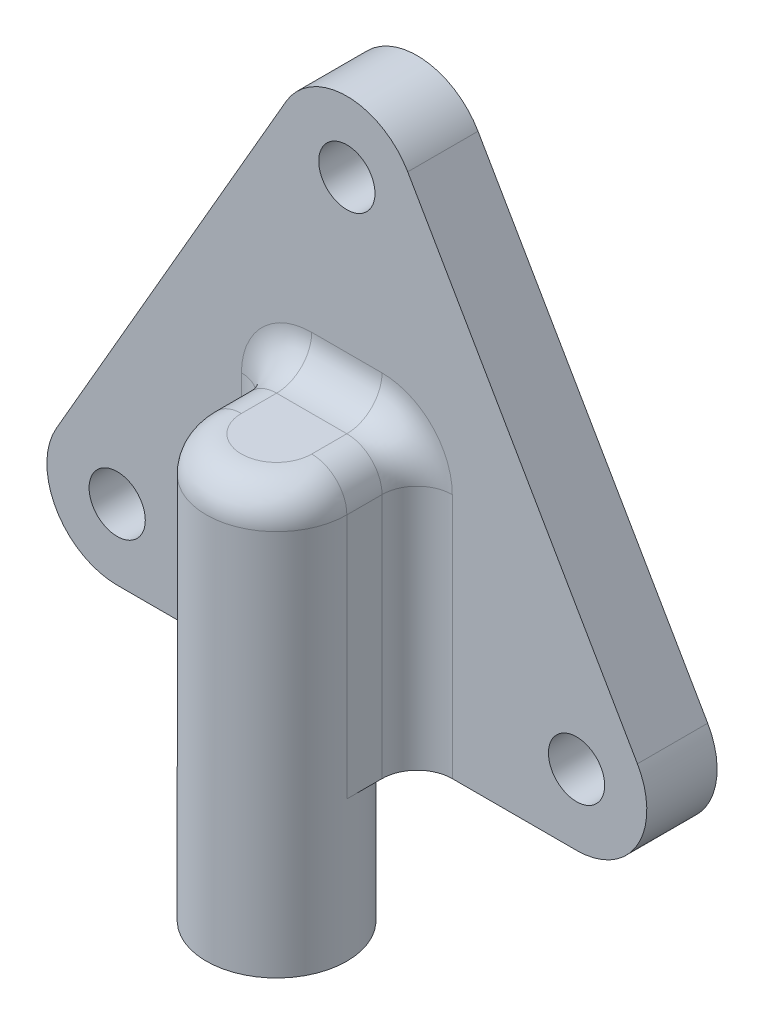
ISO-10303-21;
HEADER;
FILE_DESCRIPTION(('STEP AP214'),'2;1');
FILE_NAME('part.step','',(''),(''),'','','');
FILE_SCHEMA(('AUTOMOTIVE_DESIGN { 1 0 10303 214 1 1 1 1 }'));
ENDSEC;
DATA;
#1=APPLICATION_CONTEXT('core data for automotive mechanical design processes');
#2=APPLICATION_PROTOCOL_DEFINITION('international standard','automotive_design',2000,#1);
#3=PRODUCT_CONTEXT('',#1,'mechanical');
#4=PRODUCT('Part','Part','',(#3));
#5=PRODUCT_RELATED_PRODUCT_CATEGORY('part','',(#4));
#6=PRODUCT_DEFINITION_FORMATION('','',#4);
#7=PRODUCT_DEFINITION_CONTEXT('part definition',#1,'design');
#8=PRODUCT_DEFINITION('design','',#6,#7);
#9=PRODUCT_DEFINITION_SHAPE('','',#8);
#10=(LENGTH_UNIT() NAMED_UNIT(*) SI_UNIT(.MILLI.,.METRE.));
#11=(NAMED_UNIT(*) PLANE_ANGLE_UNIT() SI_UNIT($,.RADIAN.));
#12=(NAMED_UNIT(*) SI_UNIT($,.STERADIAN.) SOLID_ANGLE_UNIT());
#13=UNCERTAINTY_MEASURE_WITH_UNIT(LENGTH_MEASURE(1.E-05),#10,'distance_accuracy_value','');
#14=(GEOMETRIC_REPRESENTATION_CONTEXT(3) GLOBAL_UNCERTAINTY_ASSIGNED_CONTEXT((#13)) GLOBAL_UNIT_ASSIGNED_CONTEXT((#10,
#11,#12)) REPRESENTATION_CONTEXT('',''));
#15=CARTESIAN_POINT('',(0.,0.,0.));
#16=DIRECTION('',(0.,0.,1.));
#17=DIRECTION('',(1.,0.,0.));
#18=AXIS2_PLACEMENT_3D('',#15,#16,#17);
#19=CARTESIAN_POINT('',(-32.6794919243113,-28.8675134594813,10.));
#20=DIRECTION('',(0.,1.,0.));
#21=DIRECTION('',(-1.,0.,0.));
#22=AXIS2_PLACEMENT_3D('',#19,#20,#21);
#23=PLANE('',#22);
#24=CARTESIAN_POINT('',(0.,-28.8675134594813,20.));
#25=DIRECTION('',(0.,-1.,0.));
#26=DIRECTION('',(1.,0.,0.));
#27=AXIS2_PLACEMENT_3D('',#24,#25,#26);
#28=CIRCLE('',#27,10.);
#29=CARTESIAN_POINT('',(-10.,-28.8675134594813,20.));
#30=VERTEX_POINT('',#29);
#31=CARTESIAN_POINT('',(10.,-28.8675134594813,20.));
#32=VERTEX_POINT('',#31);
#33=EDGE_CURVE('E155',#30,#32,#28,.T.);
#34=ORIENTED_EDGE('',*,*,#33,.F.);
#35=DIRECTION('',(0.,0.,-1.));
#36=VECTOR('',#35,1.);
#37=CARTESIAN_POINT('',(-10.,-28.8675134594813,0.));
#38=LINE('',#37,#36);
#39=CARTESIAN_POINT('',(-10.,-28.8675134594813,15.));
#40=VERTEX_POINT('',#39);
#41=EDGE_CURVE('E161',#30,#40,#38,.T.);
#42=ORIENTED_EDGE('',*,*,#41,.T.);
#43=CARTESIAN_POINT('',(-15.,-28.8675134594813,15.));
#44=DIRECTION('',(0.,1.,0.));
#45=DIRECTION('',(-1.,0.,0.));
#46=AXIS2_PLACEMENT_3D('',#43,#44,#45);
#47=CIRCLE('',#46,5.);
#48=CARTESIAN_POINT('',(-15.,-28.8675134594813,10.));
#49=VERTEX_POINT('',#48);
#50=EDGE_CURVE('E11',#40,#49,#47,.T.);
#51=ORIENTED_EDGE('',*,*,#50,.T.);
#52=DIRECTION('',(1.,0.,0.));
#53=VECTOR('',#52,1.);
#54=CARTESIAN_POINT('',(-32.6794919243113,-28.8675134594813,10.));
#55=LINE('',#54,#53);
#56=CARTESIAN_POINT('',(-32.6794919243113,-28.8675134594813,10.));
#57=VERTEX_POINT('',#56);
#58=EDGE_CURVE('E185',#57,#49,#55,.T.);
#59=ORIENTED_EDGE('',*,*,#58,.F.);
#60=DIRECTION('',(0.,0.,-1.));
#61=VECTOR('',#60,1.);
#62=CARTESIAN_POINT('',(-32.6794919243113,-28.8675134594813,10.));
#63=LINE('',#62,#61);
#64=CARTESIAN_POINT('',(-32.6794919243113,-28.8675134594813,0.));
#65=VERTEX_POINT('',#64);
#66=EDGE_CURVE('E222',#57,#65,#63,.T.);
#67=ORIENTED_EDGE('',*,*,#66,.T.);
#68=DIRECTION('',(1.,0.,0.));
#69=VECTOR('',#68,1.);
#70=CARTESIAN_POINT('',(-32.6794919243113,-28.8675134594813,0.));
#71=LINE('',#70,#69);
#72=CARTESIAN_POINT('',(32.6794919243113,-28.8675134594813,0.));
#73=VERTEX_POINT('',#72);
#74=EDGE_CURVE('E199',#65,#73,#71,.T.);
#75=ORIENTED_EDGE('',*,*,#74,.T.);
#76=DIRECTION('',(0.,0.,-1.));
#77=VECTOR('',#76,1.);
#78=CARTESIAN_POINT('',(32.6794919243113,-28.8675134594813,10.));
#79=LINE('',#78,#77);
#80=CARTESIAN_POINT('',(32.6794919243113,-28.8675134594813,10.));
#81=VERTEX_POINT('',#80);
#82=EDGE_CURVE('E219',#81,#73,#79,.T.);
#83=ORIENTED_EDGE('',*,*,#82,.F.);
#84=CARTESIAN_POINT('',(15.,-28.8675134594813,10.));
#85=VERTEX_POINT('',#84);
#86=EDGE_CURVE('E183',#85,#81,#55,.T.);
#87=ORIENTED_EDGE('',*,*,#86,.F.);
#88=CARTESIAN_POINT('',(15.,-28.8675134594813,15.));
#89=DIRECTION('',(0.,1.,0.));
#90=DIRECTION('',(-1.,0.,0.));
#91=AXIS2_PLACEMENT_3D('',#88,#89,#90);
#92=CIRCLE('',#91,5.);
#93=CARTESIAN_POINT('',(10.,-28.8675134594813,15.));
#94=VERTEX_POINT('',#93);
#95=EDGE_CURVE('E48',#85,#94,#92,.T.);
#96=ORIENTED_EDGE('',*,*,#95,.T.);
#97=DIRECTION('',(0.,0.,1.));
#98=VECTOR('',#97,1.);
#99=CARTESIAN_POINT('',(9.99999999999999,-28.8675134594813,0.));
#100=LINE('',#99,#98);
#101=EDGE_CURVE('E159',#94,#32,#100,.T.);
#102=ORIENTED_EDGE('',*,*,#101,.T.);
#103=EDGE_LOOP('',(#34,#42,#51,#59,#67,#75,#83,#87,#96,#102));
#104=FACE_BOUND('',#103,.T.);
#105=ADVANCED_FACE('F39',(#104),#23,.F.);
#106=CARTESIAN_POINT('',(-32.6794919243113,-18.8675134594813,10.));
#107=DIRECTION('',(0.,0.,-1.));
#108=DIRECTION('',(-1.,0.,0.));
#109=AXIS2_PLACEMENT_3D('',#106,#107,#108);
#110=CYLINDRICAL_SURFACE('',#109,10.);
#111=CARTESIAN_POINT('',(-32.6794919243113,-18.8675134594813,0.));
#112=DIRECTION('',(0.,0.,1.));
#113=DIRECTION('',(1.,0.,0.));
#114=AXIS2_PLACEMENT_3D('',#111,#112,#113);
#115=CIRCLE('',#114,10.);
#116=CARTESIAN_POINT('',(-41.3397459621556,-13.8675134594813,0.));
#117=VERTEX_POINT('',#116);
#118=EDGE_CURVE('E178',#117,#65,#115,.T.);
#119=ORIENTED_EDGE('',*,*,#118,.T.);
#120=ORIENTED_EDGE('',*,*,#66,.F.);
#121=CARTESIAN_POINT('',(-32.6794919243113,-18.8675134594813,10.));
#122=DIRECTION('',(0.,0.,1.));
#123=DIRECTION('',(1.,0.,0.));
#124=AXIS2_PLACEMENT_3D('',#121,#122,#123);
#125=CIRCLE('',#124,10.);
#126=CARTESIAN_POINT('',(-41.3397459621556,-13.8675134594813,10.));
#127=VERTEX_POINT('',#126);
#128=EDGE_CURVE('E180',#127,#57,#125,.T.);
#129=ORIENTED_EDGE('',*,*,#128,.F.);
#130=DIRECTION('',(0.,0.,-1.));
#131=VECTOR('',#130,1.);
#132=CARTESIAN_POINT('',(-41.3397459621556,-13.8675134594813,10.));
#133=LINE('',#132,#131);
#134=EDGE_CURVE('E196',#127,#117,#133,.T.);
#135=ORIENTED_EDGE('',*,*,#134,.T.);
#136=EDGE_LOOP('',(#119,#120,#129,#135));
#137=FACE_BOUND('',#136,.T.);
#138=ADVANCED_FACE('F289',(#137),#110,.T.);
#139=CARTESIAN_POINT('',(32.6794919243113,-18.8675134594813,10.));
#140=DIRECTION('',(0.,0.,-1.));
#141=DIRECTION('',(-1.,0.,0.));
#142=AXIS2_PLACEMENT_3D('',#139,#140,#141);
#143=CYLINDRICAL_SURFACE('',#142,10.);
#144=CARTESIAN_POINT('',(32.6794919243113,-18.8675134594813,0.));
#145=DIRECTION('',(0.,0.,1.));
#146=DIRECTION('',(-1.,0.,0.));
#147=AXIS2_PLACEMENT_3D('',#144,#145,#146);
#148=CIRCLE('',#147,10.);
#149=CARTESIAN_POINT('',(41.3397459621556,-13.8675134594813,0.));
#150=VERTEX_POINT('',#149);
#151=EDGE_CURVE('E201',#73,#150,#148,.T.);
#152=ORIENTED_EDGE('',*,*,#151,.T.);
#153=DIRECTION('',(0.,0.,-1.));
#154=VECTOR('',#153,1.);
#155=CARTESIAN_POINT('',(41.3397459621556,-13.8675134594813,10.));
#156=LINE('',#155,#154);
#157=CARTESIAN_POINT('',(41.3397459621556,-13.8675134594813,10.));
#158=VERTEX_POINT('',#157);
#159=EDGE_CURVE('E216',#158,#150,#156,.T.);
#160=ORIENTED_EDGE('',*,*,#159,.F.);
#161=CARTESIAN_POINT('',(32.6794919243113,-18.8675134594813,10.));
#162=DIRECTION('',(0.,0.,1.));
#163=DIRECTION('',(-1.,0.,0.));
#164=AXIS2_PLACEMENT_3D('',#161,#162,#163);
#165=CIRCLE('',#164,10.);
#166=EDGE_CURVE('E188',#81,#158,#165,.T.);
#167=ORIENTED_EDGE('',*,*,#166,.F.);
#168=ORIENTED_EDGE('',*,*,#82,.T.);
#169=EDGE_LOOP('',(#152,#160,#167,#168));
#170=FACE_BOUND('',#169,.T.);
#171=ADVANCED_FACE('F297',(#170),#143,.T.);
#172=CARTESIAN_POINT('',(41.3397459621556,-13.8675134594813,10.));
#173=DIRECTION('',(-0.866025403784439,-0.5,0.));
#174=DIRECTION('',(0.5,-0.866025403784439,0.));
#175=AXIS2_PLACEMENT_3D('',#172,#173,#174);
#176=PLANE('',#175);
#177=DIRECTION('',(-0.5,0.866025403784439,0.));
#178=VECTOR('',#177,1.);
#179=CARTESIAN_POINT('',(41.3397459621556,-13.8675134594813,0.));
#180=LINE('',#179,#178);
#181=CARTESIAN_POINT('',(8.66025403784438,42.7350269189626,0.));
#182=VERTEX_POINT('',#181);
#183=EDGE_CURVE('E203',#150,#182,#180,.T.);
#184=ORIENTED_EDGE('',*,*,#183,.T.);
#185=DIRECTION('',(0.,0.,-1.));
#186=VECTOR('',#185,1.);
#187=CARTESIAN_POINT('',(8.66025403784438,42.7350269189626,10.));
#188=LINE('',#187,#186);
#189=CARTESIAN_POINT('',(8.66025403784438,42.7350269189626,10.));
#190=VERTEX_POINT('',#189);
#191=EDGE_CURVE('E213',#190,#182,#188,.T.);
#192=ORIENTED_EDGE('',*,*,#191,.F.);
#193=DIRECTION('',(-0.5,0.866025403784439,0.));
#194=VECTOR('',#193,1.);
#195=CARTESIAN_POINT('',(41.3397459621556,-13.8675134594813,10.));
#196=LINE('',#195,#194);
#197=EDGE_CURVE('E190',#158,#190,#196,.T.);
#198=ORIENTED_EDGE('',*,*,#197,.F.);
#199=ORIENTED_EDGE('',*,*,#159,.T.);
#200=EDGE_LOOP('',(#184,#192,#198,#199));
#201=FACE_BOUND('',#200,.T.);
#202=ADVANCED_FACE('F305',(#201),#176,.F.);
#203=CARTESIAN_POINT('',(0.,37.7350269189626,10.));
#204=DIRECTION('',(0.,0.,-1.));
#205=DIRECTION('',(-1.,0.,0.));
#206=AXIS2_PLACEMENT_3D('',#203,#204,#205);
#207=CYLINDRICAL_SURFACE('',#206,10.);
#208=CARTESIAN_POINT('',(0.,37.7350269189626,0.));
#209=DIRECTION('',(0.,0.,1.));
#210=DIRECTION('',(1.,0.,0.));
#211=AXIS2_PLACEMENT_3D('',#208,#209,#210);
#212=CIRCLE('',#211,10.);
#213=CARTESIAN_POINT('',(-8.66025403784439,42.7350269189626,0.));
#214=VERTEX_POINT('',#213);
#215=EDGE_CURVE('E205',#182,#214,#212,.T.);
#216=ORIENTED_EDGE('',*,*,#215,.T.);
#217=DIRECTION('',(0.,0.,-1.));
#218=VECTOR('',#217,1.);
#219=CARTESIAN_POINT('',(-8.66025403784439,42.7350269189626,10.));
#220=LINE('',#219,#218);
#221=CARTESIAN_POINT('',(-8.66025403784439,42.7350269189626,10.));
#222=VERTEX_POINT('',#221);
#223=EDGE_CURVE('E210',#222,#214,#220,.T.);
#224=ORIENTED_EDGE('',*,*,#223,.F.);
#225=CARTESIAN_POINT('',(0.,37.7350269189626,10.));
#226=DIRECTION('',(0.,0.,1.));
#227=DIRECTION('',(1.,0.,0.));
#228=AXIS2_PLACEMENT_3D('',#225,#226,#227);
#229=CIRCLE('',#228,10.);
#230=EDGE_CURVE('E192',#190,#222,#229,.T.);
#231=ORIENTED_EDGE('',*,*,#230,.F.);
#232=ORIENTED_EDGE('',*,*,#191,.T.);
#233=EDGE_LOOP('',(#216,#224,#231,#232));
#234=FACE_BOUND('',#233,.T.);
#235=ADVANCED_FACE('F309',(#234),#207,.T.);
#236=CARTESIAN_POINT('',(-8.66025403784439,42.7350269189626,10.));
#237=DIRECTION('',(0.866025403784439,-0.5,0.));
#238=DIRECTION('',(0.5,0.866025403784439,0.));
#239=AXIS2_PLACEMENT_3D('',#236,#237,#238);
#240=PLANE('',#239);
#241=DIRECTION('',(-0.5,-0.866025403784439,0.));
#242=VECTOR('',#241,1.);
#243=CARTESIAN_POINT('',(-8.66025403784439,42.7350269189626,0.));
#244=LINE('',#243,#242);
#245=EDGE_CURVE('E184',#214,#117,#244,.T.);
#246=ORIENTED_EDGE('',*,*,#245,.T.);
#247=ORIENTED_EDGE('',*,*,#134,.F.);
#248=DIRECTION('',(-0.5,-0.866025403784439,0.));
#249=VECTOR('',#248,1.);
#250=CARTESIAN_POINT('',(-8.66025403784439,42.7350269189626,10.));
#251=LINE('',#250,#249);
#252=EDGE_CURVE('E194',#222,#127,#251,.T.);
#253=ORIENTED_EDGE('',*,*,#252,.F.);
#254=ORIENTED_EDGE('',*,*,#223,.T.);
#255=EDGE_LOOP('',(#246,#247,#253,#254));
#256=FACE_BOUND('',#255,.T.);
#257=ADVANCED_FACE('F444',(#256),#240,.F.);
#258=CARTESIAN_POINT('',(-32.6794919243113,-18.8675134594813,10.));
#259=DIRECTION('',(0.,0.,1.));
#260=DIRECTION('',(1.,0.,0.));
#261=AXIS2_PLACEMENT_3D('',#258,#259,#260);
#262=PLANE('',#261);
#263=CARTESIAN_POINT('',(0.,37.7350269189626,10.));
#264=DIRECTION('',(0.,0.,1.));
#265=DIRECTION('',(1.,0.,0.));
#266=AXIS2_PLACEMENT_3D('',#263,#264,#265);
#267=CIRCLE('',#266,3.99999999999999);
#268=CARTESIAN_POINT('',(3.99999999999998,37.7350269189626,10.));
#269=VERTEX_POINT('',#268);
#270=EDGE_CURVE('E244',#269,#269,#267,.T.);
#271=ORIENTED_EDGE('',*,*,#270,.F.);
#272=EDGE_LOOP('',(#271));
#273=FACE_BOUND('',#272,.T.);
#274=CARTESIAN_POINT('',(-32.6794919243113,-18.8675134594813,10.));
#275=DIRECTION('',(0.,0.,1.));
#276=DIRECTION('',(1.,0.,0.));
#277=AXIS2_PLACEMENT_3D('',#274,#275,#276);
#278=CIRCLE('',#277,3.99999999999999);
#279=CARTESIAN_POINT('',(-28.6794919243113,-18.8675134594813,10.));
#280=VERTEX_POINT('',#279);
#281=EDGE_CURVE('E637',#280,#280,#278,.T.);
#282=ORIENTED_EDGE('',*,*,#281,.F.);
#283=EDGE_LOOP('',(#282));
#284=FACE_BOUND('',#283,.T.);
#285=CARTESIAN_POINT('',(32.6794919243113,-18.8675134594813,10.));
#286=DIRECTION('',(0.,0.,1.));
#287=DIRECTION('',(1.,0.,0.));
#288=AXIS2_PLACEMENT_3D('',#285,#286,#287);
#289=CIRCLE('',#288,3.99999999999999);
#290=CARTESIAN_POINT('',(36.6794919243112,-18.8675134594813,10.));
#291=VERTEX_POINT('',#290);
#292=EDGE_CURVE('E629',#291,#291,#289,.T.);
#293=ORIENTED_EDGE('',*,*,#292,.F.);
#294=EDGE_LOOP('',(#293));
#295=FACE_BOUND('',#294,.T.);
#296=CARTESIAN_POINT('',(5.,6.13248654051869,10.));
#297=DIRECTION('',(0.,0.,1.));
#298=DIRECTION('',(1.,0.,0.));
#299=AXIS2_PLACEMENT_3D('',#296,#297,#298);
#300=CIRCLE('',#299,10.);
#301=CARTESIAN_POINT('',(5.,16.1324865405187,10.));
#302=VERTEX_POINT('',#301);
#303=CARTESIAN_POINT('',(15.,6.13248654051869,10.));
#304=VERTEX_POINT('',#303);
#305=EDGE_CURVE('E250',#302,#304,#300,.F.);
#306=ORIENTED_EDGE('',*,*,#305,.T.);
#307=DIRECTION('',(0.,-1.,0.));
#308=VECTOR('',#307,1.);
#309=CARTESIAN_POINT('',(15.,-28.8675134594813,10.));
#310=LINE('',#309,#308);
#311=EDGE_CURVE('E252',#304,#85,#310,.T.);
#312=ORIENTED_EDGE('',*,*,#311,.T.);
#313=ORIENTED_EDGE('',*,*,#86,.T.);
#314=ORIENTED_EDGE('',*,*,#166,.T.);
#315=ORIENTED_EDGE('',*,*,#197,.T.);
#316=ORIENTED_EDGE('',*,*,#230,.T.);
#317=ORIENTED_EDGE('',*,*,#252,.T.);
#318=ORIENTED_EDGE('',*,*,#128,.T.);
#319=ORIENTED_EDGE('',*,*,#58,.T.);
#320=DIRECTION('',(0.,-1.,0.));
#321=VECTOR('',#320,1.);
#322=CARTESIAN_POINT('',(-15.,6.13248654051869,10.));
#323=LINE('',#322,#321);
#324=CARTESIAN_POINT('',(-15.,6.13248654051869,10.));
#325=VERTEX_POINT('',#324);
#326=EDGE_CURVE('E237',#49,#325,#323,.F.);
#327=ORIENTED_EDGE('',*,*,#326,.T.);
#328=CARTESIAN_POINT('',(-5.,6.13248654051869,10.));
#329=DIRECTION('',(0.,0.,1.));
#330=DIRECTION('',(1.,0.,0.));
#331=AXIS2_PLACEMENT_3D('',#328,#329,#330);
#332=CIRCLE('',#331,10.);
#333=CARTESIAN_POINT('',(-5.,16.1324865405187,10.));
#334=VERTEX_POINT('',#333);
#335=EDGE_CURVE('E246',#325,#334,#332,.F.);
#336=ORIENTED_EDGE('',*,*,#335,.T.);
#337=DIRECTION('',(-1.,0.,0.));
#338=VECTOR('',#337,1.);
#339=CARTESIAN_POINT('',(-32.6794919243113,16.1324865405187,10.));
#340=LINE('',#339,#338);
#341=EDGE_CURVE('E248',#334,#302,#340,.F.);
#342=ORIENTED_EDGE('',*,*,#341,.T.);
#343=EDGE_LOOP('',(#306,#312,#313,#314,#315,#316,#317,#318,#319,#327,#336,#342));
#344=FACE_BOUND('',#343,.T.);
#345=ADVANCED_FACE('F283',(#273,#284,#295,#344),#262,.T.);
#346=CARTESIAN_POINT('',(-32.6794919243113,-18.8675134594813,0.));
#347=DIRECTION('',(0.,0.,1.));
#348=DIRECTION('',(1.,0.,0.));
#349=AXIS2_PLACEMENT_3D('',#346,#347,#348);
#350=PLANE('',#349);
#351=CARTESIAN_POINT('',(0.,37.7350269189626,0.));
#352=DIRECTION('',(0.,0.,1.));
#353=DIRECTION('',(1.,0.,0.));
#354=AXIS2_PLACEMENT_3D('',#351,#352,#353);
#355=CIRCLE('',#354,3.99999999999999);
#356=CARTESIAN_POINT('',(3.99999999999999,37.7350269189626,0.));
#357=VERTEX_POINT('',#356);
#358=EDGE_CURVE('E640',#357,#357,#355,.T.);
#359=ORIENTED_EDGE('',*,*,#358,.T.);
#360=EDGE_LOOP('',(#359));
#361=FACE_BOUND('',#360,.T.);
#362=CARTESIAN_POINT('',(-32.6794919243113,-18.8675134594813,0.));
#363=DIRECTION('',(0.,0.,1.));
#364=DIRECTION('',(1.,0.,0.));
#365=AXIS2_PLACEMENT_3D('',#362,#363,#364);
#366=CIRCLE('',#365,3.99999999999999);
#367=CARTESIAN_POINT('',(-28.6794919243113,-18.8675134594813,0.));
#368=VERTEX_POINT('',#367);
#369=EDGE_CURVE('E634',#368,#368,#366,.T.);
#370=ORIENTED_EDGE('',*,*,#369,.T.);
#371=EDGE_LOOP('',(#370));
#372=FACE_BOUND('',#371,.T.);
#373=CARTESIAN_POINT('',(32.6794919243113,-18.8675134594813,0.));
#374=DIRECTION('',(0.,0.,1.));
#375=DIRECTION('',(1.,0.,0.));
#376=AXIS2_PLACEMENT_3D('',#373,#374,#375);
#377=CIRCLE('',#376,4.);
#378=CARTESIAN_POINT('',(36.6794919243113,-18.8675134594813,0.));
#379=VERTEX_POINT('',#378);
#380=EDGE_CURVE('E626',#379,#379,#377,.T.);
#381=ORIENTED_EDGE('',*,*,#380,.T.);
#382=EDGE_LOOP('',(#381));
#383=FACE_BOUND('',#382,.T.);
#384=ORIENTED_EDGE('',*,*,#118,.F.);
#385=ORIENTED_EDGE('',*,*,#245,.F.);
#386=ORIENTED_EDGE('',*,*,#215,.F.);
#387=ORIENTED_EDGE('',*,*,#183,.F.);
#388=ORIENTED_EDGE('',*,*,#151,.F.);
#389=ORIENTED_EDGE('',*,*,#74,.F.);
#390=EDGE_LOOP('',(#384,#385,#386,#387,#388,#389));
#391=FACE_BOUND('',#390,.T.);
#392=ADVANCED_FACE('F300',(#361,#372,#383,#391),#350,.F.);
#393=CARTESIAN_POINT('',(0.,11.1324865405187,20.));
#394=DIRECTION('',(0.,-1.,0.));
#395=DIRECTION('',(1.,0.,0.));
#396=AXIS2_PLACEMENT_3D('',#393,#394,#395);
#397=CYLINDRICAL_SURFACE('',#396,10.);
#398=DIRECTION('',(0.,-1.,0.));
#399=VECTOR('',#398,1.);
#400=CARTESIAN_POINT('',(10.,11.1324865405187,20.));
#401=LINE('',#400,#399);
#402=CARTESIAN_POINT('',(10.,6.13248654051869,20.));
#403=VERTEX_POINT('',#402);
#404=EDGE_CURVE('E158',#403,#32,#401,.T.);
#405=ORIENTED_EDGE('',*,*,#404,.F.);
#406=CARTESIAN_POINT('',(0.,6.13248654051869,20.));
#407=DIRECTION('',(0.,-1.,0.));
#408=DIRECTION('',(1.,0.,0.));
#409=AXIS2_PLACEMENT_3D('',#406,#407,#408);
#410=CIRCLE('',#409,10.);
#411=CARTESIAN_POINT('',(-10.,6.13248654051869,20.));
#412=VERTEX_POINT('',#411);
#413=EDGE_CURVE('E157',#403,#412,#410,.T.);
#414=ORIENTED_EDGE('',*,*,#413,.T.);
#415=DIRECTION('',(0.,-1.,0.));
#416=VECTOR('',#415,1.);
#417=CARTESIAN_POINT('',(-10.,11.1324865405187,20.));
#418=LINE('',#417,#416);
#419=EDGE_CURVE('E150',#412,#30,#418,.T.);
#420=ORIENTED_EDGE('',*,*,#419,.T.);
#421=ORIENTED_EDGE('',*,*,#33,.T.);
#422=EDGE_LOOP('',(#405,#414,#420,#421));
#423=FACE_BOUND('',#422,.T.);
#424=CARTESIAN_POINT('',(0.,-48.8675134594813,20.));
#425=DIRECTION('',(0.,-1.,0.));
#426=DIRECTION('',(1.,0.,0.));
#427=AXIS2_PLACEMENT_3D('',#424,#425,#426);
#428=CIRCLE('',#427,10.);
#429=CARTESIAN_POINT('',(10.,-48.8675134594813,20.));
#430=VERTEX_POINT('',#429);
#431=EDGE_CURVE('E165',#430,#430,#428,.T.);
#432=ORIENTED_EDGE('',*,*,#431,.F.);
#433=EDGE_LOOP('',(#432));
#434=FACE_BOUND('',#433,.T.);
#435=ADVANCED_FACE('F152',(#423,#434),#397,.T.);
#436=CARTESIAN_POINT('',(9.99999999999999,11.1324865405187,0.));
#437=DIRECTION('',(1.,0.,0.));
#438=DIRECTION('',(0.,0.,-1.));
#439=AXIS2_PLACEMENT_3D('',#436,#437,#438);
#440=PLANE('',#439);
#441=ORIENTED_EDGE('',*,*,#101,.F.);
#442=DIRECTION('',(0.,-1.,0.));
#443=VECTOR('',#442,1.);
#444=CARTESIAN_POINT('',(10.,6.13248654051869,15.));
#445=LINE('',#444,#443);
#446=CARTESIAN_POINT('',(10.,6.13248654051869,15.));
#447=VERTEX_POINT('',#446);
#448=EDGE_CURVE('E255',#94,#447,#445,.F.);
#449=ORIENTED_EDGE('',*,*,#448,.T.);
#450=DIRECTION('',(0.,0.,1.));
#451=VECTOR('',#450,1.);
#452=CARTESIAN_POINT('',(10.,6.13248654051869,20.));
#453=LINE('',#452,#451);
#454=EDGE_CURVE('E225',#447,#403,#453,.T.);
#455=ORIENTED_EDGE('',*,*,#454,.T.);
#456=ORIENTED_EDGE('',*,*,#404,.T.);
#457=EDGE_LOOP('',(#441,#449,#455,#456));
#458=FACE_BOUND('',#457,.T.);
#459=ADVANCED_FACE('F315',(#458),#440,.T.);
#460=CARTESIAN_POINT('',(-9.99999999999999,11.1324865405187,0.));
#461=DIRECTION('',(-1.,0.,0.));
#462=DIRECTION('',(0.,0.,1.));
#463=AXIS2_PLACEMENT_3D('',#460,#461,#462);
#464=PLANE('',#463);
#465=DIRECTION('',(0.,0.,-1.));
#466=VECTOR('',#465,1.);
#467=CARTESIAN_POINT('',(-10.,6.13248654051869,10.));
#468=LINE('',#467,#466);
#469=CARTESIAN_POINT('',(-10.,6.13248654051869,15.));
#470=VERTEX_POINT('',#469);
#471=EDGE_CURVE('E234',#412,#470,#468,.T.);
#472=ORIENTED_EDGE('',*,*,#471,.T.);
#473=DIRECTION('',(0.,-1.,0.));
#474=VECTOR('',#473,1.);
#475=CARTESIAN_POINT('',(-10.,-28.8675134594813,15.));
#476=LINE('',#475,#474);
#477=EDGE_CURVE('E56',#470,#40,#476,.T.);
#478=ORIENTED_EDGE('',*,*,#477,.T.);
#479=ORIENTED_EDGE('',*,*,#41,.F.);
#480=ORIENTED_EDGE('',*,*,#419,.F.);
#481=EDGE_LOOP('',(#472,#478,#479,#480));
#482=FACE_BOUND('',#481,.T.);
#483=ADVANCED_FACE('F162',(#482),#464,.T.);
#484=CARTESIAN_POINT('',(0.,11.1324865405187,0.));
#485=DIRECTION('',(0.,-1.,0.));
#486=DIRECTION('',(1.,0.,0.));
#487=AXIS2_PLACEMENT_3D('',#484,#485,#486);
#488=PLANE('',#487);
#489=DIRECTION('',(0.,0.,1.));
#490=VECTOR('',#489,1.);
#491=CARTESIAN_POINT('',(5.,11.1324865405187,10.));
#492=LINE('',#491,#490);
#493=CARTESIAN_POINT('',(5.00000000000001,11.1324865405187,20.));
#494=VERTEX_POINT('',#493);
#495=CARTESIAN_POINT('',(5.,11.1324865405187,15.));
#496=VERTEX_POINT('',#495);
#497=EDGE_CURVE('E231',#494,#496,#492,.F.);
#498=ORIENTED_EDGE('',*,*,#497,.T.);
#499=DIRECTION('',(-1.,0.,0.));
#500=VECTOR('',#499,1.);
#501=CARTESIAN_POINT('',(0.,11.1324865405187,15.));
#502=LINE('',#501,#500);
#503=CARTESIAN_POINT('',(-5.,11.1324865405187,15.));
#504=VERTEX_POINT('',#503);
#505=EDGE_CURVE('E259',#496,#504,#502,.T.);
#506=ORIENTED_EDGE('',*,*,#505,.T.);
#507=DIRECTION('',(0.,0.,-1.));
#508=VECTOR('',#507,1.);
#509=CARTESIAN_POINT('',(-5.,11.1324865405187,20.));
#510=LINE('',#509,#508);
#511=CARTESIAN_POINT('',(-5.00000000000001,11.1324865405187,20.));
#512=VERTEX_POINT('',#511);
#513=EDGE_CURVE('E229',#504,#512,#510,.F.);
#514=ORIENTED_EDGE('',*,*,#513,.T.);
#515=CARTESIAN_POINT('',(0.,11.1324865405187,20.));
#516=DIRECTION('',(0.,-1.,0.));
#517=DIRECTION('',(1.,0.,0.));
#518=AXIS2_PLACEMENT_3D('',#515,#516,#517);
#519=CIRCLE('',#518,5.00000000000001);
#520=EDGE_CURVE('E227',#512,#494,#519,.F.);
#521=ORIENTED_EDGE('',*,*,#520,.T.);
#522=EDGE_LOOP('',(#498,#506,#514,#521));
#523=FACE_BOUND('',#522,.T.);
#524=ADVANCED_FACE('F329',(#523),#488,.F.);
#525=CARTESIAN_POINT('',(0.,-48.8675134594813,0.));
#526=DIRECTION('',(0.,-1.,0.));
#527=DIRECTION('',(1.,0.,0.));
#528=AXIS2_PLACEMENT_3D('',#525,#526,#527);
#529=PLANE('',#528);
#530=CARTESIAN_POINT('',(0.,-48.8675134594813,20.));
#531=DIRECTION('',(0.,-1.,0.));
#532=DIRECTION('',(0.,0.,-1.));
#533=AXIS2_PLACEMENT_3D('',#530,#531,#532);
#534=CIRCLE('',#533,4.99999999999999);
#535=CARTESIAN_POINT('',(0.,-48.8675134594813,15.));
#536=VERTEX_POINT('',#535);
#537=EDGE_CURVE('E174',#536,#536,#534,.T.);
#538=ORIENTED_EDGE('',*,*,#537,.F.);
#539=EDGE_LOOP('',(#538));
#540=FACE_BOUND('',#539,.T.);
#541=ORIENTED_EDGE('',*,*,#431,.T.);
#542=EDGE_LOOP('',(#541));
#543=FACE_BOUND('',#542,.T.);
#544=ADVANCED_FACE('F412',(#540,#543),#529,.T.);
#545=CARTESIAN_POINT('',(0.,-3.86751345948131,20.));
#546=DIRECTION('',(0.,1.,0.));
#547=DIRECTION('',(0.,0.,1.));
#548=AXIS2_PLACEMENT_3D('',#545,#546,#547);
#549=PLANE('',#548);
#550=CARTESIAN_POINT('',(0.,-3.86751345948131,20.));
#551=DIRECTION('',(0.,-1.,0.));
#552=DIRECTION('',(0.,0.,-1.));
#553=AXIS2_PLACEMENT_3D('',#550,#551,#552);
#554=CIRCLE('',#553,4.99999999999998);
#555=CARTESIAN_POINT('',(0.,-3.86751345948131,15.));
#556=VERTEX_POINT('',#555);
#557=EDGE_CURVE('E169',#556,#556,#554,.T.);
#558=ORIENTED_EDGE('',*,*,#557,.T.);
#559=EDGE_LOOP('',(#558));
#560=FACE_BOUND('',#559,.T.);
#561=ADVANCED_FACE('F519',(#560),#549,.F.);
#562=CARTESIAN_POINT('',(0.,-48.8675134594813,20.));
#563=DIRECTION('',(0.,-1.,0.));
#564=DIRECTION('',(0.,0.,-1.));
#565=AXIS2_PLACEMENT_3D('',#562,#563,#564);
#566=CYLINDRICAL_SURFACE('',#565,4.99999999999999);
#567=ORIENTED_EDGE('',*,*,#557,.F.);
#568=EDGE_LOOP('',(#567));
#569=FACE_BOUND('',#568,.T.);
#570=ORIENTED_EDGE('',*,*,#537,.T.);
#571=EDGE_LOOP('',(#570));
#572=FACE_BOUND('',#571,.T.);
#573=ADVANCED_FACE('F500',(#569,#572),#566,.F.);
#574=CARTESIAN_POINT('',(32.6794919243113,-18.8675134594813,10.));
#575=DIRECTION('',(0.,0.,1.));
#576=DIRECTION('',(1.,0.,0.));
#577=AXIS2_PLACEMENT_3D('',#574,#575,#576);
#578=CYLINDRICAL_SURFACE('',#577,3.99999999999999);
#579=ORIENTED_EDGE('',*,*,#380,.F.);
#580=EDGE_LOOP('',(#579));
#581=FACE_BOUND('',#580,.T.);
#582=ORIENTED_EDGE('',*,*,#292,.T.);
#583=EDGE_LOOP('',(#582));
#584=FACE_BOUND('',#583,.T.);
#585=ADVANCED_FACE('F489',(#581,#584),#578,.F.);
#586=CARTESIAN_POINT('',(-32.6794919243113,-18.8675134594813,10.));
#587=DIRECTION('',(0.,0.,1.));
#588=DIRECTION('',(1.,0.,0.));
#589=AXIS2_PLACEMENT_3D('',#586,#587,#588);
#590=CYLINDRICAL_SURFACE('',#589,3.99999999999999);
#591=ORIENTED_EDGE('',*,*,#369,.F.);
#592=EDGE_LOOP('',(#591));
#593=FACE_BOUND('',#592,.T.);
#594=ORIENTED_EDGE('',*,*,#281,.T.);
#595=EDGE_LOOP('',(#594));
#596=FACE_BOUND('',#595,.T.);
#597=ADVANCED_FACE('F478',(#593,#596),#590,.F.);
#598=CARTESIAN_POINT('',(0.,37.7350269189626,10.));
#599=DIRECTION('',(0.,0.,1.));
#600=DIRECTION('',(1.,0.,0.));
#601=AXIS2_PLACEMENT_3D('',#598,#599,#600);
#602=CYLINDRICAL_SURFACE('',#601,3.99999999999999);
#603=ORIENTED_EDGE('',*,*,#358,.F.);
#604=EDGE_LOOP('',(#603));
#605=FACE_BOUND('',#604,.T.);
#606=ORIENTED_EDGE('',*,*,#270,.T.);
#607=EDGE_LOOP('',(#606));
#608=FACE_BOUND('',#607,.T.);
#609=ADVANCED_FACE('F357',(#605,#608),#602,.F.);
#610=CARTESIAN_POINT('',(-4.99999999999999,6.13248654051869,0.));
#611=DIRECTION('',(0.,0.,1.));
#612=DIRECTION('',(1.,0.,0.));
#613=AXIS2_PLACEMENT_3D('',#610,#611,#612);
#614=CYLINDRICAL_SURFACE('',#613,5.);
#615=ORIENTED_EDGE('',*,*,#513,.F.);
#616=CARTESIAN_POINT('',(-5.,6.13248654051869,15.));
#617=DIRECTION('',(0.,0.,1.));
#618=DIRECTION('',(1.,0.,0.));
#619=AXIS2_PLACEMENT_3D('',#616,#617,#618);
#620=CIRCLE('',#619,5.);
#621=EDGE_CURVE('E64',#504,#470,#620,.T.);
#622=ORIENTED_EDGE('',*,*,#621,.T.);
#623=ORIENTED_EDGE('',*,*,#471,.F.);
#624=CARTESIAN_POINT('',(-5.,6.13248654051869,20.));
#625=DIRECTION('',(0.,0.,1.));
#626=DIRECTION('',(1.,0.,0.));
#627=AXIS2_PLACEMENT_3D('',#624,#625,#626);
#628=CIRCLE('',#627,5.);
#629=EDGE_CURVE('E241',#512,#412,#628,.T.);
#630=ORIENTED_EDGE('',*,*,#629,.F.);
#631=EDGE_LOOP('',(#615,#622,#623,#630));
#632=FACE_BOUND('',#631,.T.);
#633=ADVANCED_FACE('F353',(#632),#614,.T.);
#634=CARTESIAN_POINT('',(0.,6.13248654051869,20.));
#635=DIRECTION('',(0.,-1.,0.));
#636=DIRECTION('',(1.,0.,0.));
#637=AXIS2_PLACEMENT_3D('',#634,#635,#636);
#638=TOROIDAL_SURFACE('',#637,5.00000000000001,5.);
#639=ORIENTED_EDGE('',*,*,#629,.T.);
#640=ORIENTED_EDGE('',*,*,#413,.F.);
#641=CARTESIAN_POINT('',(5.00000000000001,6.13248654051869,20.));
#642=DIRECTION('',(0.,0.,-1.));
#643=DIRECTION('',(-1.,0.,0.));
#644=AXIS2_PLACEMENT_3D('',#641,#642,#643);
#645=CIRCLE('',#644,5.);
#646=EDGE_CURVE('E238',#494,#403,#645,.T.);
#647=ORIENTED_EDGE('',*,*,#646,.F.);
#648=ORIENTED_EDGE('',*,*,#520,.F.);
#649=EDGE_LOOP('',(#639,#640,#647,#648));
#650=FACE_BOUND('',#649,.T.);
#651=ADVANCED_FACE('F350',(#650),#638,.T.);
#652=CARTESIAN_POINT('',(4.99999999999999,6.13248654051869,0.));
#653=DIRECTION('',(0.,0.,-1.));
#654=DIRECTION('',(-1.,0.,0.));
#655=AXIS2_PLACEMENT_3D('',#652,#653,#654);
#656=CYLINDRICAL_SURFACE('',#655,5.);
#657=ORIENTED_EDGE('',*,*,#454,.F.);
#658=CARTESIAN_POINT('',(5.,6.13248654051869,15.));
#659=DIRECTION('',(0.,0.,1.));
#660=DIRECTION('',(1.,0.,0.));
#661=AXIS2_PLACEMENT_3D('',#658,#659,#660);
#662=CIRCLE('',#661,5.);
#663=EDGE_CURVE('E257',#447,#496,#662,.T.);
#664=ORIENTED_EDGE('',*,*,#663,.T.);
#665=ORIENTED_EDGE('',*,*,#497,.F.);
#666=ORIENTED_EDGE('',*,*,#646,.T.);
#667=EDGE_LOOP('',(#657,#664,#665,#666));
#668=FACE_BOUND('',#667,.T.);
#669=ADVANCED_FACE('F326',(#668),#656,.T.);
#670=CARTESIAN_POINT('',(-15.,11.1324865405187,15.));
#671=DIRECTION('',(0.,1.,0.));
#672=DIRECTION('',(-1.,0.,0.));
#673=AXIS2_PLACEMENT_3D('',#670,#671,#672);
#674=CYLINDRICAL_SURFACE('',#673,5.);
#675=ORIENTED_EDGE('',*,*,#50,.F.);
#676=ORIENTED_EDGE('',*,*,#477,.F.);
#677=CARTESIAN_POINT('',(-15.,6.13248654051869,15.));
#678=DIRECTION('',(0.,-1.,0.));
#679=DIRECTION('',(0.,0.,-1.));
#680=AXIS2_PLACEMENT_3D('',#677,#678,#679);
#681=CIRCLE('',#680,5.);
#682=EDGE_CURVE('E43',#325,#470,#681,.T.);
#683=ORIENTED_EDGE('',*,*,#682,.F.);
#684=ORIENTED_EDGE('',*,*,#326,.F.);
#685=EDGE_LOOP('',(#675,#676,#683,#684));
#686=FACE_BOUND('',#685,.T.);
#687=ADVANCED_FACE('F41',(#686),#674,.F.);
#688=CARTESIAN_POINT('',(-5.,6.13248654051869,15.));
#689=DIRECTION('',(0.,0.,1.));
#690=DIRECTION('',(1.,0.,0.));
#691=AXIS2_PLACEMENT_3D('',#688,#689,#690);
#692=TOROIDAL_SURFACE('',#691,10.,5.);
#693=ORIENTED_EDGE('',*,*,#682,.T.);
#694=ORIENTED_EDGE('',*,*,#621,.F.);
#695=CARTESIAN_POINT('',(-5.,16.1324865405187,15.));
#696=DIRECTION('',(-1.,0.,0.));
#697=DIRECTION('',(0.,0.,1.));
#698=AXIS2_PLACEMENT_3D('',#695,#696,#697);
#699=CIRCLE('',#698,5.);
#700=EDGE_CURVE('E269',#334,#504,#699,.T.);
#701=ORIENTED_EDGE('',*,*,#700,.F.);
#702=ORIENTED_EDGE('',*,*,#335,.F.);
#703=EDGE_LOOP('',(#693,#694,#701,#702));
#704=FACE_BOUND('',#703,.T.);
#705=ADVANCED_FACE('F279',(#704),#692,.F.);
#706=CARTESIAN_POINT('',(0.,16.1324865405187,15.));
#707=DIRECTION('',(-1.,0.,0.));
#708=DIRECTION('',(0.,-1.,0.));
#709=AXIS2_PLACEMENT_3D('',#706,#707,#708);
#710=CYLINDRICAL_SURFACE('',#709,5.);
#711=ORIENTED_EDGE('',*,*,#700,.T.);
#712=ORIENTED_EDGE('',*,*,#505,.F.);
#713=CARTESIAN_POINT('',(5.,16.1324865405187,15.));
#714=DIRECTION('',(-1.,0.,0.));
#715=DIRECTION('',(0.,0.,1.));
#716=AXIS2_PLACEMENT_3D('',#713,#714,#715);
#717=CIRCLE('',#716,5.);
#718=EDGE_CURVE('E267',#302,#496,#717,.T.);
#719=ORIENTED_EDGE('',*,*,#718,.F.);
#720=ORIENTED_EDGE('',*,*,#341,.F.);
#721=EDGE_LOOP('',(#711,#712,#719,#720));
#722=FACE_BOUND('',#721,.T.);
#723=ADVANCED_FACE('F331',(#722),#710,.F.);
#724=CARTESIAN_POINT('',(5.,6.13248654051869,15.));
#725=DIRECTION('',(0.,0.,1.));
#726=DIRECTION('',(1.,0.,0.));
#727=AXIS2_PLACEMENT_3D('',#724,#725,#726);
#728=TOROIDAL_SURFACE('',#727,10.,5.);
#729=ORIENTED_EDGE('',*,*,#718,.T.);
#730=ORIENTED_EDGE('',*,*,#663,.F.);
#731=CARTESIAN_POINT('',(15.,6.13248654051869,15.));
#732=DIRECTION('',(0.,1.,0.));
#733=DIRECTION('',(0.,0.,1.));
#734=AXIS2_PLACEMENT_3D('',#731,#732,#733);
#735=CIRCLE('',#734,5.);
#736=EDGE_CURVE('E264',#304,#447,#735,.T.);
#737=ORIENTED_EDGE('',*,*,#736,.F.);
#738=ORIENTED_EDGE('',*,*,#305,.F.);
#739=EDGE_LOOP('',(#729,#730,#737,#738));
#740=FACE_BOUND('',#739,.T.);
#741=ADVANCED_FACE('F322',(#740),#728,.F.);
#742=CARTESIAN_POINT('',(15.,-18.8675134594813,15.));
#743=DIRECTION('',(0.,1.,0.));
#744=DIRECTION('',(-1.,0.,0.));
#745=AXIS2_PLACEMENT_3D('',#742,#743,#744);
#746=CYLINDRICAL_SURFACE('',#745,5.);
#747=ORIENTED_EDGE('',*,*,#736,.T.);
#748=ORIENTED_EDGE('',*,*,#448,.F.);
#749=ORIENTED_EDGE('',*,*,#95,.F.);
#750=ORIENTED_EDGE('',*,*,#311,.F.);
#751=EDGE_LOOP('',(#747,#748,#749,#750));
#752=FACE_BOUND('',#751,.T.);
#753=ADVANCED_FACE('F317',(#752),#746,.F.);
#754=CLOSED_SHELL('',(#105,#138,#171,#202,#235,#257,#345,#392,#435,#459,#483,#524,#544,#561,
#573,#585,#597,#609,#633,#651,#669,#687,#705,#723,#741,#753));
#755=MANIFOLD_SOLID_BREP('B2',#754);
#756=ADVANCED_BREP_SHAPE_REPRESENTATION('',(#18,#755),#14);
#757=SHAPE_DEFINITION_REPRESENTATION(#9,#756);
ENDSEC;
END-ISO-10303-21;
